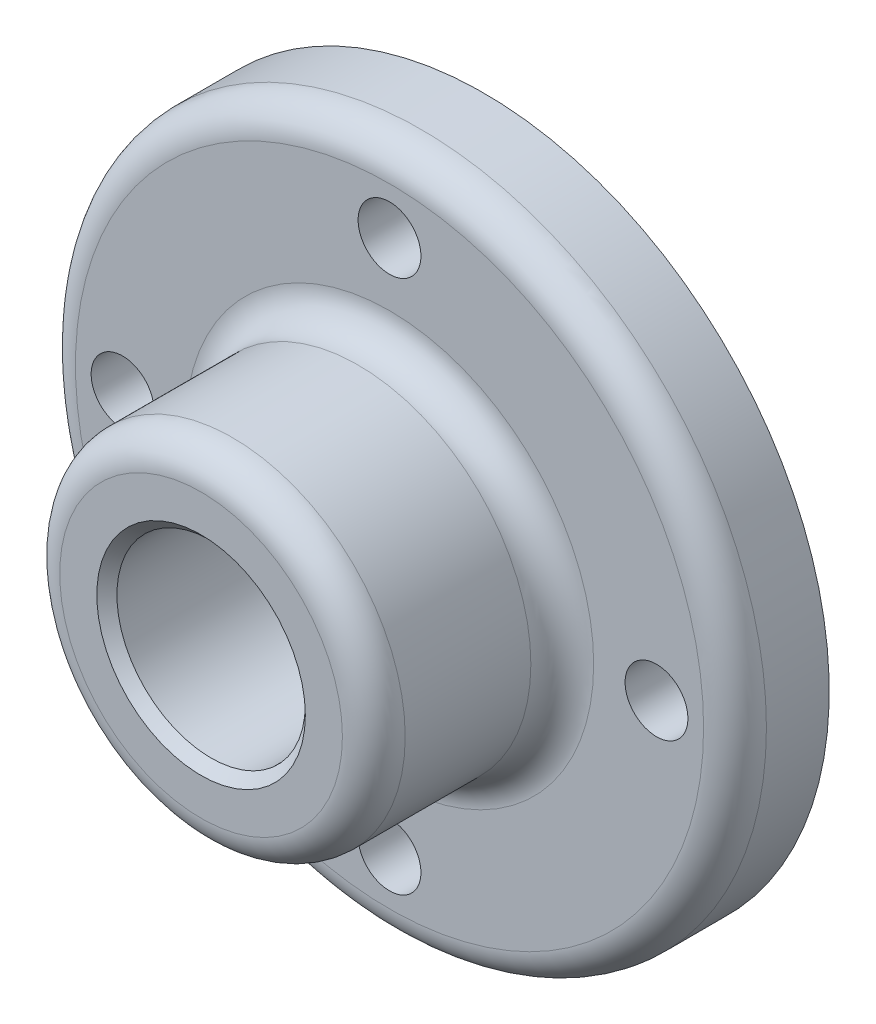
ISO-10303-21;
HEADER;
FILE_DESCRIPTION(('STEP AP214'),'2;1');
FILE_NAME('part.step','',(''),(''),'','','');
FILE_SCHEMA(('AUTOMOTIVE_DESIGN { 1 0 10303 214 1 1 1 1 }'));
ENDSEC;
DATA;
#1=APPLICATION_CONTEXT('core data for automotive mechanical design processes');
#2=APPLICATION_PROTOCOL_DEFINITION('international standard','automotive_design',2000,#1);
#3=PRODUCT_CONTEXT('',#1,'mechanical');
#4=PRODUCT('Part','Part','',(#3));
#5=PRODUCT_RELATED_PRODUCT_CATEGORY('part','',(#4));
#6=PRODUCT_DEFINITION_FORMATION('','',#4);
#7=PRODUCT_DEFINITION_CONTEXT('part definition',#1,'design');
#8=PRODUCT_DEFINITION('design','',#6,#7);
#9=PRODUCT_DEFINITION_SHAPE('','',#8);
#10=(LENGTH_UNIT() NAMED_UNIT(*) SI_UNIT(.MILLI.,.METRE.));
#11=(NAMED_UNIT(*) PLANE_ANGLE_UNIT() SI_UNIT($,.RADIAN.));
#12=(NAMED_UNIT(*) SI_UNIT($,.STERADIAN.) SOLID_ANGLE_UNIT());
#13=UNCERTAINTY_MEASURE_WITH_UNIT(LENGTH_MEASURE(1.E-05),#10,'distance_accuracy_value','');
#14=(GEOMETRIC_REPRESENTATION_CONTEXT(3) GLOBAL_UNCERTAINTY_ASSIGNED_CONTEXT((#13)) GLOBAL_UNIT_ASSIGNED_CONTEXT((#10,
#11,#12)) REPRESENTATION_CONTEXT('',''));
#15=CARTESIAN_POINT('',(0.,0.,0.));
#16=DIRECTION('',(0.,0.,1.));
#17=DIRECTION('',(1.,0.,0.));
#18=AXIS2_PLACEMENT_3D('',#15,#16,#17);
#19=CARTESIAN_POINT('',(0.,0.,19.05));
#20=DIRECTION('',(0.,0.,-1.));
#21=DIRECTION('',(-1.,0.,0.));
#22=AXIS2_PLACEMENT_3D('',#19,#20,#21);
#23=CYLINDRICAL_SURFACE('',#22,69.85);
#24=CARTESIAN_POINT('',(0.,0.,12.7));
#25=DIRECTION('',(0.,0.,1.));
#26=DIRECTION('',(1.,0.,0.));
#27=AXIS2_PLACEMENT_3D('',#24,#25,#26);
#28=CIRCLE('',#27,69.85);
#29=CARTESIAN_POINT('',(-69.85,0.,12.7));
#30=VERTEX_POINT('',#29);
#31=EDGE_CURVE('E51',#30,#30,#28,.F.);
#32=CARTESIAN_POINT('',(0.,0.,0.));
#33=DIRECTION('',(0.,0.,1.));
#34=DIRECTION('',(1.,0.,0.));
#35=AXIS2_PLACEMENT_3D('',#32,#33,#34);
#36=CIRCLE('',#35,69.85);
#37=CARTESIAN_POINT('',(-69.85,0.,0.));
#38=VERTEX_POINT('',#37);
#39=EDGE_CURVE('E72',#38,#38,#36,.T.);
#40=CARTESIAN_POINT('',(-69.85,0.,12.7));
#41=CARTESIAN_POINT('',(-69.85,0.,12.5677083333333));
#42=CARTESIAN_POINT('',(-69.85,0.,12.4354166666667));
#43=CARTESIAN_POINT('',(-69.85,0.,12.1708333333333));
#44=CARTESIAN_POINT('',(-69.85,0.,12.0385416666667));
#45=CARTESIAN_POINT('',(-69.85,0.,11.7739583333333));
#46=CARTESIAN_POINT('',(-69.85,0.,11.6416666666667));
#47=CARTESIAN_POINT('',(-69.85,0.,11.3770833333333));
#48=CARTESIAN_POINT('',(-69.85,0.,11.2447916666667));
#49=CARTESIAN_POINT('',(-69.85,0.,10.9802083333333));
#50=CARTESIAN_POINT('',(-69.85,0.,10.8479166666667));
#51=CARTESIAN_POINT('',(-69.85,0.,10.5833333333333));
#52=CARTESIAN_POINT('',(-69.85,0.,10.4510416666667));
#53=CARTESIAN_POINT('',(-69.85,0.,10.1864583333333));
#54=CARTESIAN_POINT('',(-69.85,0.,10.0541666666667));
#55=CARTESIAN_POINT('',(-69.85,0.,9.78958333333333));
#56=CARTESIAN_POINT('',(-69.85,0.,9.65729166666667));
#57=CARTESIAN_POINT('',(-69.85,0.,9.39270833333333));
#58=CARTESIAN_POINT('',(-69.85,0.,9.26041666666667));
#59=CARTESIAN_POINT('',(-69.85,0.,8.99583333333334));
#60=CARTESIAN_POINT('',(-69.85,0.,8.86354166666667));
#61=CARTESIAN_POINT('',(-69.85,0.,8.59895833333333));
#62=CARTESIAN_POINT('',(-69.85,0.,8.46666666666667));
#63=CARTESIAN_POINT('',(-69.85,0.,8.20208333333333));
#64=CARTESIAN_POINT('',(-69.85,0.,8.06979166666667));
#65=CARTESIAN_POINT('',(-69.85,0.,7.80520833333333));
#66=CARTESIAN_POINT('',(-69.85,0.,7.67291666666667));
#67=CARTESIAN_POINT('',(-69.85,0.,7.40833333333333));
#68=CARTESIAN_POINT('',(-69.85,0.,7.27604166666667));
#69=CARTESIAN_POINT('',(-69.85,0.,7.01145833333333));
#70=CARTESIAN_POINT('',(-69.85,0.,6.87916666666667));
#71=CARTESIAN_POINT('',(-69.85,0.,6.61458333333333));
#72=CARTESIAN_POINT('',(-69.85,0.,6.48229166666667));
#73=CARTESIAN_POINT('',(-69.85,0.,6.21770833333333));
#74=CARTESIAN_POINT('',(-69.85,0.,6.08541666666667));
#75=CARTESIAN_POINT('',(-69.85,0.,5.82083333333333));
#76=CARTESIAN_POINT('',(-69.85,0.,5.68854166666667));
#77=CARTESIAN_POINT('',(-69.85,0.,5.42395833333333));
#78=CARTESIAN_POINT('',(-69.85,0.,5.29166666666667));
#79=CARTESIAN_POINT('',(-69.85,0.,5.02708333333333));
#80=CARTESIAN_POINT('',(-69.85,0.,4.89479166666667));
#81=CARTESIAN_POINT('',(-69.85,0.,4.63020833333333));
#82=CARTESIAN_POINT('',(-69.85,0.,4.49791666666667));
#83=CARTESIAN_POINT('',(-69.85,0.,4.23333333333333));
#84=CARTESIAN_POINT('',(-69.85,0.,4.10104166666667));
#85=CARTESIAN_POINT('',(-69.85,0.,3.83645833333333));
#86=CARTESIAN_POINT('',(-69.85,0.,3.70416666666667));
#87=CARTESIAN_POINT('',(-69.85,0.,3.43958333333333));
#88=CARTESIAN_POINT('',(-69.85,0.,3.30729166666667));
#89=CARTESIAN_POINT('',(-69.85,0.,3.04270833333333));
#90=CARTESIAN_POINT('',(-69.85,0.,2.91041666666667));
#91=CARTESIAN_POINT('',(-69.85,0.,2.64583333333333));
#92=CARTESIAN_POINT('',(-69.85,0.,2.51354166666667));
#93=CARTESIAN_POINT('',(-69.85,0.,2.24895833333333));
#94=CARTESIAN_POINT('',(-69.85,0.,2.11666666666667));
#95=CARTESIAN_POINT('',(-69.85,0.,1.85208333333333));
#96=CARTESIAN_POINT('',(-69.85,0.,1.71979166666667));
#97=CARTESIAN_POINT('',(-69.85,0.,1.45520833333333));
#98=CARTESIAN_POINT('',(-69.85,0.,1.32291666666667));
#99=CARTESIAN_POINT('',(-69.85,0.,1.05833333333333));
#100=CARTESIAN_POINT('',(-69.85,0.,0.926041666666666));
#101=CARTESIAN_POINT('',(-69.85,0.,0.661458333333332));
#102=CARTESIAN_POINT('',(-69.85,0.,0.529166666666665));
#103=CARTESIAN_POINT('',(-69.85,0.,0.264583333333332));
#104=CARTESIAN_POINT('',(-69.85,0.,0.132291666666666));
#105=CARTESIAN_POINT('',(-69.85,0.,0.));
#106=B_SPLINE_CURVE_WITH_KNOTS('',3,(#40,#41,#42,#43,#44,#45,#46,#47,#48,#49,#50,#51,#52,#53,
#54,#55,#56,#57,#58,#59,#60,#61,#62,#63,#64,#65,#66,#67,#68,#69,#70,#71,#72,#73,#74,#75,#76,#77,
#78,#79,#80,#81,#82,#83,#84,#85,#86,#87,#88,#89,#90,#91,#92,#93,#94,#95,#96,#97,#98,#99,#100,
#101,#102,#103,#104,#105),.UNSPECIFIED.,.F.,.F.,(4,2,2,2,2,2,2,2,2,2,2,2,2,2,2,2,2,2,2,2,2,2,2,
2,2,2,2,2,2,2,2,2,4),(0.,0.396874999999998,0.793749999999999,1.190625,1.5875,1.984375,2.38125,
2.778125,3.175,3.571875,3.96875,4.365625,4.7625,5.159375,5.55625,5.953125,6.35,6.746875,7.14375,
7.540625,7.9375,8.334375,8.73125,9.128125,9.525,9.921875,10.31875,10.715625,11.1125,11.509375,
11.90625,12.303125,12.7),.UNSPECIFIED.);
#107=EDGE_CURVE('BSEAM39',#30,#38,#106,.T.);
#108=ORIENTED_EDGE('',*,*,#31,.T.);
#109=ORIENTED_EDGE('',*,*,#39,.T.);
#110=ORIENTED_EDGE('',*,*,#107,.T.);
#111=ORIENTED_EDGE('',*,*,#107,.F.);
#112=EDGE_LOOP('',(#108,#110,#109,#111));
#113=FACE_BOUND('',#112,.T.);
#114=ADVANCED_FACE('F39',(#113),#23,.T.);
#115=CARTESIAN_POINT('',(0.,0.,19.05));
#116=DIRECTION('',(0.,0.,1.));
#117=DIRECTION('',(1.,0.,0.));
#118=AXIS2_PLACEMENT_3D('',#115,#116,#117);
#119=PLANE('',#118);
#120=CARTESIAN_POINT('',(0.,0.,19.05));
#121=DIRECTION('',(0.,0.,1.));
#122=DIRECTION('',(1.,0.,0.));
#123=AXIS2_PLACEMENT_3D('',#120,#121,#122);
#124=CIRCLE('',#123,41.275);
#125=CARTESIAN_POINT('',(41.275,0.,19.05));
#126=VERTEX_POINT('',#125);
#127=EDGE_CURVE('E55',#126,#126,#124,.F.);
#128=ORIENTED_EDGE('',*,*,#127,.T.);
#129=EDGE_LOOP('',(#128));
#130=FACE_BOUND('',#129,.T.);
#131=CARTESIAN_POINT('',(0.,0.,19.05));
#132=DIRECTION('',(0.,0.,1.));
#133=DIRECTION('',(1.,0.,0.));
#134=AXIS2_PLACEMENT_3D('',#131,#132,#133);
#135=CIRCLE('',#134,63.5);
#136=CARTESIAN_POINT('',(63.5,0.,19.05));
#137=VERTEX_POINT('',#136);
#138=EDGE_CURVE('E60',#137,#137,#135,.T.);
#139=ORIENTED_EDGE('',*,*,#138,.T.);
#140=EDGE_LOOP('',(#139));
#141=FACE_BOUND('',#140,.T.);
#142=CARTESIAN_POINT('',(0.,53.975,19.05));
#143=DIRECTION('',(0.,0.,1.));
#144=DIRECTION('',(1.,0.,0.));
#145=AXIS2_PLACEMENT_3D('',#142,#143,#144);
#146=CIRCLE('',#145,6.35);
#147=CARTESIAN_POINT('',(6.35,53.975,19.05));
#148=VERTEX_POINT('',#147);
#149=EDGE_CURVE('E97',#148,#148,#146,.T.);
#150=ORIENTED_EDGE('',*,*,#149,.F.);
#151=EDGE_LOOP('',(#150));
#152=FACE_BOUND('',#151,.T.);
#153=CARTESIAN_POINT('',(53.975,-1.88452705264058E-13,19.05));
#154=DIRECTION('',(0.,0.,1.));
#155=DIRECTION('',(1.,0.,0.));
#156=AXIS2_PLACEMENT_3D('',#153,#154,#155);
#157=CIRCLE('',#156,6.35);
#158=CARTESIAN_POINT('',(60.325,-1.88452705264058E-13,19.05));
#159=VERTEX_POINT('',#158);
#160=EDGE_CURVE('E94',#159,#159,#157,.T.);
#161=ORIENTED_EDGE('',*,*,#160,.F.);
#162=EDGE_LOOP('',(#161));
#163=FACE_BOUND('',#162,.T.);
#164=CARTESIAN_POINT('',(-3.76905410528116E-13,-53.975,19.05));
#165=DIRECTION('',(0.,0.,1.));
#166=DIRECTION('',(1.,0.,0.));
#167=AXIS2_PLACEMENT_3D('',#164,#165,#166);
#168=CIRCLE('',#167,6.35);
#169=CARTESIAN_POINT('',(6.34999999999962,-53.975,19.05));
#170=VERTEX_POINT('',#169);
#171=EDGE_CURVE('E88',#170,#170,#168,.T.);
#172=ORIENTED_EDGE('',*,*,#171,.F.);
#173=EDGE_LOOP('',(#172));
#174=FACE_BOUND('',#173,.T.);
#175=CARTESIAN_POINT('',(-53.975,5.65358115792174E-13,19.05));
#176=DIRECTION('',(0.,0.,1.));
#177=DIRECTION('',(1.,0.,0.));
#178=AXIS2_PLACEMENT_3D('',#175,#176,#177);
#179=CIRCLE('',#178,6.35);
#180=CARTESIAN_POINT('',(-47.625,5.65358115792174E-13,19.05));
#181=VERTEX_POINT('',#180);
#182=EDGE_CURVE('E82',#181,#181,#179,.T.);
#183=ORIENTED_EDGE('',*,*,#182,.F.);
#184=EDGE_LOOP('',(#183));
#185=FACE_BOUND('',#184,.T.);
#186=ADVANCED_FACE('F114',(#130,#141,#152,#163,#174,#185),#119,.T.);
#187=CARTESIAN_POINT('',(0.,0.,0.));
#188=DIRECTION('',(0.,0.,1.));
#189=DIRECTION('',(1.,0.,0.));
#190=AXIS2_PLACEMENT_3D('',#187,#188,#189);
#191=PLANE('',#190);
#192=CARTESIAN_POINT('',(0.,53.975,0.));
#193=DIRECTION('',(0.,0.,1.));
#194=DIRECTION('',(1.,0.,0.));
#195=AXIS2_PLACEMENT_3D('',#192,#193,#194);
#196=CIRCLE('',#195,6.35);
#197=CARTESIAN_POINT('',(6.35,53.975,0.));
#198=VERTEX_POINT('',#197);
#199=EDGE_CURVE('E78',#198,#198,#196,.T.);
#200=ORIENTED_EDGE('',*,*,#199,.T.);
#201=EDGE_LOOP('',(#200));
#202=FACE_BOUND('',#201,.T.);
#203=CARTESIAN_POINT('',(53.975,-1.88452705264058E-13,0.));
#204=DIRECTION('',(0.,0.,1.));
#205=DIRECTION('',(1.,0.,0.));
#206=AXIS2_PLACEMENT_3D('',#203,#204,#205);
#207=CIRCLE('',#206,6.35);
#208=CARTESIAN_POINT('',(60.325,-1.88452705264058E-13,0.));
#209=VERTEX_POINT('',#208);
#210=EDGE_CURVE('E91',#209,#209,#207,.T.);
#211=ORIENTED_EDGE('',*,*,#210,.T.);
#212=EDGE_LOOP('',(#211));
#213=FACE_BOUND('',#212,.T.);
#214=CARTESIAN_POINT('',(-3.76905410528116E-13,-53.975,0.));
#215=DIRECTION('',(0.,0.,1.));
#216=DIRECTION('',(1.,0.,0.));
#217=AXIS2_PLACEMENT_3D('',#214,#215,#216);
#218=CIRCLE('',#217,6.35);
#219=CARTESIAN_POINT('',(6.34999999999962,-53.975,0.));
#220=VERTEX_POINT('',#219);
#221=EDGE_CURVE('E85',#220,#220,#218,.T.);
#222=ORIENTED_EDGE('',*,*,#221,.T.);
#223=EDGE_LOOP('',(#222));
#224=FACE_BOUND('',#223,.T.);
#225=CARTESIAN_POINT('',(-53.975,5.65358115792174E-13,0.));
#226=DIRECTION('',(0.,0.,1.));
#227=DIRECTION('',(1.,0.,0.));
#228=AXIS2_PLACEMENT_3D('',#225,#226,#227);
#229=CIRCLE('',#228,6.35);
#230=CARTESIAN_POINT('',(-47.625,5.65358115792174E-13,0.));
#231=VERTEX_POINT('',#230);
#232=EDGE_CURVE('E79',#231,#231,#229,.T.);
#233=ORIENTED_EDGE('',*,*,#232,.T.);
#234=EDGE_LOOP('',(#233));
#235=FACE_BOUND('',#234,.T.);
#236=CARTESIAN_POINT('',(0.,0.,0.));
#237=DIRECTION('',(0.,0.,1.));
#238=DIRECTION('',(1.,0.,0.));
#239=AXIS2_PLACEMENT_3D('',#236,#237,#238);
#240=CIRCLE('',#239,19.05);
#241=CARTESIAN_POINT('',(19.05,0.,0.));
#242=VERTEX_POINT('',#241);
#243=EDGE_CURVE('E75',#242,#242,#240,.T.);
#244=ORIENTED_EDGE('',*,*,#243,.T.);
#245=EDGE_LOOP('',(#244));
#246=FACE_BOUND('',#245,.T.);
#247=ORIENTED_EDGE('',*,*,#39,.F.);
#248=EDGE_LOOP('',(#247));
#249=FACE_BOUND('',#248,.T.);
#250=ADVANCED_FACE('F103',(#202,#213,#224,#235,#246,#249),#191,.F.);
#251=CARTESIAN_POINT('',(0.,0.,-79.7328173317607));
#252=DIRECTION('',(0.,0.,1.));
#253=DIRECTION('',(1.,0.,0.));
#254=AXIS2_PLACEMENT_3D('',#251,#252,#253);
#255=CYLINDRICAL_SURFACE('',#254,34.925);
#256=CARTESIAN_POINT('',(0.,0.,50.8));
#257=DIRECTION('',(0.,0.,1.));
#258=DIRECTION('',(1.,0.,0.));
#259=AXIS2_PLACEMENT_3D('',#256,#257,#258);
#260=CIRCLE('',#259,34.925);
#261=CARTESIAN_POINT('',(34.925,0.,50.8));
#262=VERTEX_POINT('',#261);
#263=EDGE_CURVE('E63',#262,#262,#260,.F.);
#264=ORIENTED_EDGE('',*,*,#263,.T.);
#265=EDGE_LOOP('',(#264));
#266=FACE_BOUND('',#265,.T.);
#267=CARTESIAN_POINT('',(0.,0.,25.4));
#268=DIRECTION('',(0.,0.,1.));
#269=DIRECTION('',(1.,0.,0.));
#270=AXIS2_PLACEMENT_3D('',#267,#268,#269);
#271=CIRCLE('',#270,34.925);
#272=CARTESIAN_POINT('',(34.925,0.,25.4));
#273=VERTEX_POINT('',#272);
#274=EDGE_CURVE('E66',#273,#273,#271,.T.);
#275=ORIENTED_EDGE('',*,*,#274,.T.);
#276=EDGE_LOOP('',(#275));
#277=FACE_BOUND('',#276,.T.);
#278=ADVANCED_FACE('F180',(#266,#277),#255,.T.);
#279=CARTESIAN_POINT('',(0.,0.,57.15));
#280=DIRECTION('',(0.,0.,1.));
#281=DIRECTION('',(1.,0.,0.));
#282=AXIS2_PLACEMENT_3D('',#279,#280,#281);
#283=PLANE('',#282);
#284=CARTESIAN_POINT('',(0.,0.,57.15));
#285=DIRECTION('',(0.,0.,1.));
#286=DIRECTION('',(1.,0.,0.));
#287=AXIS2_PLACEMENT_3D('',#284,#285,#286);
#288=CIRCLE('',#287,21.082);
#289=CARTESIAN_POINT('',(21.082,0.,57.15));
#290=VERTEX_POINT('',#289);
#291=EDGE_CURVE('E10',#290,#290,#288,.F.);
#292=ORIENTED_EDGE('',*,*,#291,.T.);
#293=EDGE_LOOP('',(#292));
#294=FACE_BOUND('',#293,.T.);
#295=CARTESIAN_POINT('',(0.,0.,57.15));
#296=DIRECTION('',(0.,0.,1.));
#297=DIRECTION('',(1.,0.,0.));
#298=AXIS2_PLACEMENT_3D('',#295,#296,#297);
#299=CIRCLE('',#298,28.575);
#300=CARTESIAN_POINT('',(28.575,0.,57.15));
#301=VERTEX_POINT('',#300);
#302=EDGE_CURVE('E69',#301,#301,#299,.T.);
#303=ORIENTED_EDGE('',*,*,#302,.T.);
#304=EDGE_LOOP('',(#303));
#305=FACE_BOUND('',#304,.T.);
#306=ADVANCED_FACE('F138',(#294,#305),#283,.T.);
#307=CARTESIAN_POINT('',(0.,0.,0.));
#308=DIRECTION('',(0.,0.,1.));
#309=DIRECTION('',(1.,0.,0.));
#310=AXIS2_PLACEMENT_3D('',#307,#308,#309);
#311=CYLINDRICAL_SURFACE('',#310,19.05);
#312=CARTESIAN_POINT('',(0.,0.,55.118));
#313=DIRECTION('',(0.,0.,1.));
#314=DIRECTION('',(1.,0.,0.));
#315=AXIS2_PLACEMENT_3D('',#312,#313,#314);
#316=CIRCLE('',#315,19.05);
#317=CARTESIAN_POINT('',(19.05,0.,55.118));
#318=VERTEX_POINT('',#317);
#319=EDGE_CURVE('E47',#318,#318,#316,.T.);
#320=ORIENTED_EDGE('',*,*,#319,.T.);
#321=EDGE_LOOP('',(#320));
#322=FACE_BOUND('',#321,.T.);
#323=ORIENTED_EDGE('',*,*,#243,.F.);
#324=EDGE_LOOP('',(#323));
#325=FACE_BOUND('',#324,.T.);
#326=ADVANCED_FACE('F128',(#322,#325),#311,.F.);
#327=CARTESIAN_POINT('',(-53.975,5.65358115792174E-13,0.));
#328=DIRECTION('',(0.,0.,1.));
#329=DIRECTION('',(1.,0.,0.));
#330=AXIS2_PLACEMENT_3D('',#327,#328,#329);
#331=CYLINDRICAL_SURFACE('',#330,6.35);
#332=CARTESIAN_POINT('',(-47.625,5.65358115792174E-13,0.));
#333=CARTESIAN_POINT('',(-47.625,5.65358115792174E-13,0.1984375));
#334=CARTESIAN_POINT('',(-47.625,5.65358115792174E-13,0.396875));
#335=CARTESIAN_POINT('',(-47.625,5.65358115792174E-13,0.79375));
#336=CARTESIAN_POINT('',(-47.625,5.65358115792174E-13,0.9921875));
#337=CARTESIAN_POINT('',(-47.625,5.65358115792174E-13,1.3890625));
#338=CARTESIAN_POINT('',(-47.625,5.65358115792174E-13,1.5875));
#339=CARTESIAN_POINT('',(-47.625,5.65358115792174E-13,1.984375));
#340=CARTESIAN_POINT('',(-47.625,5.65358115792174E-13,2.1828125));
#341=CARTESIAN_POINT('',(-47.625,5.65358115792174E-13,2.5796875));
#342=CARTESIAN_POINT('',(-47.625,5.65358115792174E-13,2.778125));
#343=CARTESIAN_POINT('',(-47.625,5.65358115792174E-13,3.175));
#344=CARTESIAN_POINT('',(-47.625,5.65358115792174E-13,3.3734375));
#345=CARTESIAN_POINT('',(-47.625,5.65358115792174E-13,3.7703125));
#346=CARTESIAN_POINT('',(-47.625,5.65358115792174E-13,3.96875));
#347=CARTESIAN_POINT('',(-47.625,5.65358115792174E-13,4.365625));
#348=CARTESIAN_POINT('',(-47.625,5.65358115792174E-13,4.5640625));
#349=CARTESIAN_POINT('',(-47.625,5.65358115792174E-13,4.9609375));
#350=CARTESIAN_POINT('',(-47.625,5.65358115792174E-13,5.159375));
#351=CARTESIAN_POINT('',(-47.625,5.65358115792174E-13,5.55625));
#352=CARTESIAN_POINT('',(-47.625,5.65358115792174E-13,5.7546875));
#353=CARTESIAN_POINT('',(-47.625,5.65358115792174E-13,6.1515625));
#354=CARTESIAN_POINT('',(-47.625,5.65358115792174E-13,6.35));
#355=CARTESIAN_POINT('',(-47.625,5.65358115792174E-13,6.746875));
#356=CARTESIAN_POINT('',(-47.625,5.65358115792174E-13,6.9453125));
#357=CARTESIAN_POINT('',(-47.625,5.65358115792174E-13,7.3421875));
#358=CARTESIAN_POINT('',(-47.625,5.65358115792174E-13,7.540625));
#359=CARTESIAN_POINT('',(-47.625,5.65358115792174E-13,7.9375));
#360=CARTESIAN_POINT('',(-47.625,5.65358115792174E-13,8.1359375));
#361=CARTESIAN_POINT('',(-47.625,5.65358115792174E-13,8.5328125));
#362=CARTESIAN_POINT('',(-47.625,5.65358115792174E-13,8.73125));
#363=CARTESIAN_POINT('',(-47.625,5.65358115792174E-13,9.128125));
#364=CARTESIAN_POINT('',(-47.625,5.65358115792174E-13,9.3265625));
#365=CARTESIAN_POINT('',(-47.625,5.65358115792174E-13,9.7234375));
#366=CARTESIAN_POINT('',(-47.625,5.65358115792174E-13,9.921875));
#367=CARTESIAN_POINT('',(-47.625,5.65358115792174E-13,10.31875));
#368=CARTESIAN_POINT('',(-47.625,5.65358115792174E-13,10.5171875));
#369=CARTESIAN_POINT('',(-47.625,5.65358115792174E-13,10.9140625));
#370=CARTESIAN_POINT('',(-47.625,5.65358115792174E-13,11.1125));
#371=CARTESIAN_POINT('',(-47.625,5.65358115792174E-13,11.509375));
#372=CARTESIAN_POINT('',(-47.625,5.65358115792174E-13,11.7078125));
#373=CARTESIAN_POINT('',(-47.625,5.65358115792174E-13,12.1046875));
#374=CARTESIAN_POINT('',(-47.625,5.65358115792174E-13,12.303125));
#375=CARTESIAN_POINT('',(-47.625,5.65358115792174E-13,12.7));
#376=CARTESIAN_POINT('',(-47.625,5.65358115792174E-13,12.8984375));
#377=CARTESIAN_POINT('',(-47.625,5.65358115792174E-13,13.2953125));
#378=CARTESIAN_POINT('',(-47.625,5.65358115792174E-13,13.49375));
#379=CARTESIAN_POINT('',(-47.625,5.65358115792174E-13,13.890625));
#380=CARTESIAN_POINT('',(-47.625,5.65358115792174E-13,14.0890625));
#381=CARTESIAN_POINT('',(-47.625,5.65358115792174E-13,14.4859375));
#382=CARTESIAN_POINT('',(-47.625,5.65358115792174E-13,14.684375));
#383=CARTESIAN_POINT('',(-47.625,5.65358115792174E-13,15.08125));
#384=CARTESIAN_POINT('',(-47.625,5.65358115792174E-13,15.2796875));
#385=CARTESIAN_POINT('',(-47.625,5.65358115792174E-13,15.6765625));
#386=CARTESIAN_POINT('',(-47.625,5.65358115792174E-13,15.875));
#387=CARTESIAN_POINT('',(-47.625,5.65358115792174E-13,16.271875));
#388=CARTESIAN_POINT('',(-47.625,5.65358115792174E-13,16.4703125));
#389=CARTESIAN_POINT('',(-47.625,5.65358115792174E-13,16.8671875));
#390=CARTESIAN_POINT('',(-47.625,5.65358115792174E-13,17.065625));
#391=CARTESIAN_POINT('',(-47.625,5.65358115792174E-13,17.4625));
#392=CARTESIAN_POINT('',(-47.625,5.65358115792174E-13,17.6609375));
#393=CARTESIAN_POINT('',(-47.625,5.65358115792174E-13,18.0578125));
#394=CARTESIAN_POINT('',(-47.625,5.65358115792174E-13,18.25625));
#395=CARTESIAN_POINT('',(-47.625,5.65358115792174E-13,18.653125));
#396=CARTESIAN_POINT('',(-47.625,5.65358115792174E-13,18.8515625));
#397=CARTESIAN_POINT('',(-47.625,5.65358115792174E-13,19.05));
#398=B_SPLINE_CURVE_WITH_KNOTS('',3,(#332,#333,#334,#335,#336,#337,#338,#339,#340,#341,#342,
#343,#344,#345,#346,#347,#348,#349,#350,#351,#352,#353,#354,#355,#356,#357,#358,#359,#360,#361,
#362,#363,#364,#365,#366,#367,#368,#369,#370,#371,#372,#373,#374,#375,#376,#377,#378,#379,#380,
#381,#382,#383,#384,#385,#386,#387,#388,#389,#390,#391,#392,#393,#394,#395,#396,#397),
.UNSPECIFIED.,.F.,.F.,(4,2,2,2,2,2,2,2,2,2,2,2,2,2,2,2,2,2,2,2,2,2,2,2,2,2,2,2,2,2,2,2,4),(0.,
0.5953125,1.190625,1.7859375,2.38125,2.9765625,3.571875,4.1671875,4.7625,5.3578125,5.953125,
6.5484375,7.14375,7.7390625,8.334375,8.9296875,9.525,10.1203125,10.715625,11.3109375,11.90625,
12.5015625,13.096875,13.6921875,14.2875,14.8828125,15.478125,16.0734375,16.66875,17.2640625,
17.859375,18.4546875,19.05),.UNSPECIFIED.);
#399=EDGE_CURVE('BSEAM125',#231,#181,#398,.T.);
#400=ORIENTED_EDGE('',*,*,#232,.F.);
#401=ORIENTED_EDGE('',*,*,#182,.T.);
#402=ORIENTED_EDGE('',*,*,#399,.T.);
#403=ORIENTED_EDGE('',*,*,#399,.F.);
#404=EDGE_LOOP('',(#400,#402,#401,#403));
#405=FACE_BOUND('',#404,.T.);
#406=ADVANCED_FACE('F125',(#405),#331,.F.);
#407=CARTESIAN_POINT('',(-3.76905410528116E-13,-53.975,0.));
#408=DIRECTION('',(0.,0.,1.));
#409=DIRECTION('',(1.,0.,0.));
#410=AXIS2_PLACEMENT_3D('',#407,#408,#409);
#411=CYLINDRICAL_SURFACE('',#410,6.35);
#412=CARTESIAN_POINT('',(6.34999999999962,-53.975,0.));
#413=CARTESIAN_POINT('',(6.34999999999962,-53.975,0.1984375));
#414=CARTESIAN_POINT('',(6.34999999999962,-53.975,0.396875));
#415=CARTESIAN_POINT('',(6.34999999999962,-53.975,0.79375));
#416=CARTESIAN_POINT('',(6.34999999999962,-53.975,0.9921875));
#417=CARTESIAN_POINT('',(6.34999999999962,-53.975,1.3890625));
#418=CARTESIAN_POINT('',(6.34999999999962,-53.975,1.5875));
#419=CARTESIAN_POINT('',(6.34999999999962,-53.975,1.984375));
#420=CARTESIAN_POINT('',(6.34999999999962,-53.975,2.1828125));
#421=CARTESIAN_POINT('',(6.34999999999962,-53.975,2.5796875));
#422=CARTESIAN_POINT('',(6.34999999999962,-53.975,2.778125));
#423=CARTESIAN_POINT('',(6.34999999999962,-53.975,3.175));
#424=CARTESIAN_POINT('',(6.34999999999962,-53.975,3.3734375));
#425=CARTESIAN_POINT('',(6.34999999999962,-53.975,3.7703125));
#426=CARTESIAN_POINT('',(6.34999999999962,-53.975,3.96875));
#427=CARTESIAN_POINT('',(6.34999999999962,-53.975,4.365625));
#428=CARTESIAN_POINT('',(6.34999999999962,-53.975,4.5640625));
#429=CARTESIAN_POINT('',(6.34999999999962,-53.975,4.9609375));
#430=CARTESIAN_POINT('',(6.34999999999962,-53.975,5.159375));
#431=CARTESIAN_POINT('',(6.34999999999962,-53.975,5.55625));
#432=CARTESIAN_POINT('',(6.34999999999962,-53.975,5.7546875));
#433=CARTESIAN_POINT('',(6.34999999999962,-53.975,6.1515625));
#434=CARTESIAN_POINT('',(6.34999999999962,-53.975,6.35));
#435=CARTESIAN_POINT('',(6.34999999999962,-53.975,6.746875));
#436=CARTESIAN_POINT('',(6.34999999999962,-53.975,6.9453125));
#437=CARTESIAN_POINT('',(6.34999999999962,-53.975,7.3421875));
#438=CARTESIAN_POINT('',(6.34999999999962,-53.975,7.540625));
#439=CARTESIAN_POINT('',(6.34999999999962,-53.975,7.9375));
#440=CARTESIAN_POINT('',(6.34999999999962,-53.975,8.1359375));
#441=CARTESIAN_POINT('',(6.34999999999962,-53.975,8.5328125));
#442=CARTESIAN_POINT('',(6.34999999999962,-53.975,8.73125));
#443=CARTESIAN_POINT('',(6.34999999999962,-53.975,9.128125));
#444=CARTESIAN_POINT('',(6.34999999999962,-53.975,9.3265625));
#445=CARTESIAN_POINT('',(6.34999999999962,-53.975,9.7234375));
#446=CARTESIAN_POINT('',(6.34999999999962,-53.975,9.921875));
#447=CARTESIAN_POINT('',(6.34999999999962,-53.975,10.31875));
#448=CARTESIAN_POINT('',(6.34999999999962,-53.975,10.5171875));
#449=CARTESIAN_POINT('',(6.34999999999962,-53.975,10.9140625));
#450=CARTESIAN_POINT('',(6.34999999999962,-53.975,11.1125));
#451=CARTESIAN_POINT('',(6.34999999999962,-53.975,11.509375));
#452=CARTESIAN_POINT('',(6.34999999999962,-53.975,11.7078125));
#453=CARTESIAN_POINT('',(6.34999999999962,-53.975,12.1046875));
#454=CARTESIAN_POINT('',(6.34999999999962,-53.975,12.303125));
#455=CARTESIAN_POINT('',(6.34999999999962,-53.975,12.7));
#456=CARTESIAN_POINT('',(6.34999999999962,-53.975,12.8984375));
#457=CARTESIAN_POINT('',(6.34999999999962,-53.975,13.2953125));
#458=CARTESIAN_POINT('',(6.34999999999962,-53.975,13.49375));
#459=CARTESIAN_POINT('',(6.34999999999962,-53.975,13.890625));
#460=CARTESIAN_POINT('',(6.34999999999962,-53.975,14.0890625));
#461=CARTESIAN_POINT('',(6.34999999999962,-53.975,14.4859375));
#462=CARTESIAN_POINT('',(6.34999999999962,-53.975,14.684375));
#463=CARTESIAN_POINT('',(6.34999999999962,-53.975,15.08125));
#464=CARTESIAN_POINT('',(6.34999999999962,-53.975,15.2796875));
#465=CARTESIAN_POINT('',(6.34999999999962,-53.975,15.6765625));
#466=CARTESIAN_POINT('',(6.34999999999962,-53.975,15.875));
#467=CARTESIAN_POINT('',(6.34999999999962,-53.975,16.271875));
#468=CARTESIAN_POINT('',(6.34999999999962,-53.975,16.4703125));
#469=CARTESIAN_POINT('',(6.34999999999962,-53.975,16.8671875));
#470=CARTESIAN_POINT('',(6.34999999999962,-53.975,17.065625));
#471=CARTESIAN_POINT('',(6.34999999999962,-53.975,17.4625));
#472=CARTESIAN_POINT('',(6.34999999999962,-53.975,17.6609375));
#473=CARTESIAN_POINT('',(6.34999999999962,-53.975,18.0578125));
#474=CARTESIAN_POINT('',(6.34999999999962,-53.975,18.25625));
#475=CARTESIAN_POINT('',(6.34999999999962,-53.975,18.653125));
#476=CARTESIAN_POINT('',(6.34999999999962,-53.975,18.8515625));
#477=CARTESIAN_POINT('',(6.34999999999962,-53.975,19.05));
#478=B_SPLINE_CURVE_WITH_KNOTS('',3,(#412,#413,#414,#415,#416,#417,#418,#419,#420,#421,#422,
#423,#424,#425,#426,#427,#428,#429,#430,#431,#432,#433,#434,#435,#436,#437,#438,#439,#440,#441,
#442,#443,#444,#445,#446,#447,#448,#449,#450,#451,#452,#453,#454,#455,#456,#457,#458,#459,#460,
#461,#462,#463,#464,#465,#466,#467,#468,#469,#470,#471,#472,#473,#474,#475,#476,#477),
.UNSPECIFIED.,.F.,.F.,(4,2,2,2,2,2,2,2,2,2,2,2,2,2,2,2,2,2,2,2,2,2,2,2,2,2,2,2,2,2,2,2,4),(0.,
0.5953125,1.190625,1.7859375,2.38125,2.9765625,3.571875,4.1671875,4.7625,5.3578125,5.953125,
6.5484375,7.14375,7.7390625,8.334375,8.9296875,9.525,10.1203125,10.715625,11.3109375,11.90625,
12.5015625,13.096875,13.6921875,14.2875,14.8828125,15.478125,16.0734375,16.66875,17.2640625,
17.859375,18.4546875,19.05),.UNSPECIFIED.);
#479=EDGE_CURVE('BSEAM127',#220,#170,#478,.T.);
#480=ORIENTED_EDGE('',*,*,#221,.F.);
#481=ORIENTED_EDGE('',*,*,#171,.T.);
#482=ORIENTED_EDGE('',*,*,#479,.T.);
#483=ORIENTED_EDGE('',*,*,#479,.F.);
#484=EDGE_LOOP('',(#480,#482,#481,#483));
#485=FACE_BOUND('',#484,.T.);
#486=ADVANCED_FACE('F127',(#485),#411,.F.);
#487=CARTESIAN_POINT('',(53.975,-1.88452705264058E-13,0.));
#488=DIRECTION('',(0.,0.,1.));
#489=DIRECTION('',(1.,0.,0.));
#490=AXIS2_PLACEMENT_3D('',#487,#488,#489);
#491=CYLINDRICAL_SURFACE('',#490,6.35);
#492=CARTESIAN_POINT('',(60.325,-1.88452705264058E-13,0.));
#493=CARTESIAN_POINT('',(60.325,-1.88452705264058E-13,0.1984375));
#494=CARTESIAN_POINT('',(60.325,-1.88452705264058E-13,0.396875));
#495=CARTESIAN_POINT('',(60.325,-1.88452705264058E-13,0.79375));
#496=CARTESIAN_POINT('',(60.325,-1.88452705264058E-13,0.9921875));
#497=CARTESIAN_POINT('',(60.325,-1.88452705264058E-13,1.3890625));
#498=CARTESIAN_POINT('',(60.325,-1.88452705264058E-13,1.5875));
#499=CARTESIAN_POINT('',(60.325,-1.88452705264058E-13,1.984375));
#500=CARTESIAN_POINT('',(60.325,-1.88452705264058E-13,2.1828125));
#501=CARTESIAN_POINT('',(60.325,-1.88452705264058E-13,2.5796875));
#502=CARTESIAN_POINT('',(60.325,-1.88452705264058E-13,2.778125));
#503=CARTESIAN_POINT('',(60.325,-1.88452705264058E-13,3.175));
#504=CARTESIAN_POINT('',(60.325,-1.88452705264058E-13,3.3734375));
#505=CARTESIAN_POINT('',(60.325,-1.88452705264058E-13,3.7703125));
#506=CARTESIAN_POINT('',(60.325,-1.88452705264058E-13,3.96875));
#507=CARTESIAN_POINT('',(60.325,-1.88452705264058E-13,4.365625));
#508=CARTESIAN_POINT('',(60.325,-1.88452705264058E-13,4.5640625));
#509=CARTESIAN_POINT('',(60.325,-1.88452705264058E-13,4.9609375));
#510=CARTESIAN_POINT('',(60.325,-1.88452705264058E-13,5.159375));
#511=CARTESIAN_POINT('',(60.325,-1.88452705264058E-13,5.55625));
#512=CARTESIAN_POINT('',(60.325,-1.88452705264058E-13,5.7546875));
#513=CARTESIAN_POINT('',(60.325,-1.88452705264058E-13,6.1515625));
#514=CARTESIAN_POINT('',(60.325,-1.88452705264058E-13,6.35));
#515=CARTESIAN_POINT('',(60.325,-1.88452705264058E-13,6.746875));
#516=CARTESIAN_POINT('',(60.325,-1.88452705264058E-13,6.9453125));
#517=CARTESIAN_POINT('',(60.325,-1.88452705264058E-13,7.3421875));
#518=CARTESIAN_POINT('',(60.325,-1.88452705264058E-13,7.540625));
#519=CARTESIAN_POINT('',(60.325,-1.88452705264058E-13,7.9375));
#520=CARTESIAN_POINT('',(60.325,-1.88452705264058E-13,8.1359375));
#521=CARTESIAN_POINT('',(60.325,-1.88452705264058E-13,8.5328125));
#522=CARTESIAN_POINT('',(60.325,-1.88452705264058E-13,8.73125));
#523=CARTESIAN_POINT('',(60.325,-1.88452705264058E-13,9.128125));
#524=CARTESIAN_POINT('',(60.325,-1.88452705264058E-13,9.3265625));
#525=CARTESIAN_POINT('',(60.325,-1.88452705264058E-13,9.7234375));
#526=CARTESIAN_POINT('',(60.325,-1.88452705264058E-13,9.921875));
#527=CARTESIAN_POINT('',(60.325,-1.88452705264058E-13,10.31875));
#528=CARTESIAN_POINT('',(60.325,-1.88452705264058E-13,10.5171875));
#529=CARTESIAN_POINT('',(60.325,-1.88452705264058E-13,10.9140625));
#530=CARTESIAN_POINT('',(60.325,-1.88452705264058E-13,11.1125));
#531=CARTESIAN_POINT('',(60.325,-1.88452705264058E-13,11.509375));
#532=CARTESIAN_POINT('',(60.325,-1.88452705264058E-13,11.7078125));
#533=CARTESIAN_POINT('',(60.325,-1.88452705264058E-13,12.1046875));
#534=CARTESIAN_POINT('',(60.325,-1.88452705264058E-13,12.303125));
#535=CARTESIAN_POINT('',(60.325,-1.88452705264058E-13,12.7));
#536=CARTESIAN_POINT('',(60.325,-1.88452705264058E-13,12.8984375));
#537=CARTESIAN_POINT('',(60.325,-1.88452705264058E-13,13.2953125));
#538=CARTESIAN_POINT('',(60.325,-1.88452705264058E-13,13.49375));
#539=CARTESIAN_POINT('',(60.325,-1.88452705264058E-13,13.890625));
#540=CARTESIAN_POINT('',(60.325,-1.88452705264058E-13,14.0890625));
#541=CARTESIAN_POINT('',(60.325,-1.88452705264058E-13,14.4859375));
#542=CARTESIAN_POINT('',(60.325,-1.88452705264058E-13,14.684375));
#543=CARTESIAN_POINT('',(60.325,-1.88452705264058E-13,15.08125));
#544=CARTESIAN_POINT('',(60.325,-1.88452705264058E-13,15.2796875));
#545=CARTESIAN_POINT('',(60.325,-1.88452705264058E-13,15.6765625));
#546=CARTESIAN_POINT('',(60.325,-1.88452705264058E-13,15.875));
#547=CARTESIAN_POINT('',(60.325,-1.88452705264058E-13,16.271875));
#548=CARTESIAN_POINT('',(60.325,-1.88452705264058E-13,16.4703125));
#549=CARTESIAN_POINT('',(60.325,-1.88452705264058E-13,16.8671875));
#550=CARTESIAN_POINT('',(60.325,-1.88452705264058E-13,17.065625));
#551=CARTESIAN_POINT('',(60.325,-1.88452705264058E-13,17.4625));
#552=CARTESIAN_POINT('',(60.325,-1.88452705264058E-13,17.6609375));
#553=CARTESIAN_POINT('',(60.325,-1.88452705264058E-13,18.0578125));
#554=CARTESIAN_POINT('',(60.325,-1.88452705264058E-13,18.25625));
#555=CARTESIAN_POINT('',(60.325,-1.88452705264058E-13,18.653125));
#556=CARTESIAN_POINT('',(60.325,-1.88452705264058E-13,18.8515625));
#557=CARTESIAN_POINT('',(60.325,-1.88452705264058E-13,19.05));
#558=B_SPLINE_CURVE_WITH_KNOTS('',3,(#492,#493,#494,#495,#496,#497,#498,#499,#500,#501,#502,
#503,#504,#505,#506,#507,#508,#509,#510,#511,#512,#513,#514,#515,#516,#517,#518,#519,#520,#521,
#522,#523,#524,#525,#526,#527,#528,#529,#530,#531,#532,#533,#534,#535,#536,#537,#538,#539,#540,
#541,#542,#543,#544,#545,#546,#547,#548,#549,#550,#551,#552,#553,#554,#555,#556,#557),
.UNSPECIFIED.,.F.,.F.,(4,2,2,2,2,2,2,2,2,2,2,2,2,2,2,2,2,2,2,2,2,2,2,2,2,2,2,2,2,2,2,2,4),(0.,
0.5953125,1.190625,1.7859375,2.38125,2.9765625,3.571875,4.1671875,4.7625,5.3578125,5.953125,
6.5484375,7.14375,7.7390625,8.334375,8.9296875,9.525,10.1203125,10.715625,11.3109375,11.90625,
12.5015625,13.096875,13.6921875,14.2875,14.8828125,15.478125,16.0734375,16.66875,17.2640625,
17.859375,18.4546875,19.05),.UNSPECIFIED.);
#559=EDGE_CURVE('BSEAM110',#209,#159,#558,.T.);
#560=ORIENTED_EDGE('',*,*,#210,.F.);
#561=ORIENTED_EDGE('',*,*,#160,.T.);
#562=ORIENTED_EDGE('',*,*,#559,.T.);
#563=ORIENTED_EDGE('',*,*,#559,.F.);
#564=EDGE_LOOP('',(#560,#562,#561,#563));
#565=FACE_BOUND('',#564,.T.);
#566=ADVANCED_FACE('F110',(#565),#491,.F.);
#567=CARTESIAN_POINT('',(0.,53.975,0.));
#568=DIRECTION('',(0.,0.,1.));
#569=DIRECTION('',(1.,0.,0.));
#570=AXIS2_PLACEMENT_3D('',#567,#568,#569);
#571=CYLINDRICAL_SURFACE('',#570,6.35);
#572=CARTESIAN_POINT('',(6.35,53.975,0.));
#573=CARTESIAN_POINT('',(6.35,53.975,0.1984375));
#574=CARTESIAN_POINT('',(6.35,53.975,0.396875));
#575=CARTESIAN_POINT('',(6.35,53.975,0.79375));
#576=CARTESIAN_POINT('',(6.35,53.975,0.9921875));
#577=CARTESIAN_POINT('',(6.35,53.975,1.3890625));
#578=CARTESIAN_POINT('',(6.35,53.975,1.5875));
#579=CARTESIAN_POINT('',(6.35,53.975,1.984375));
#580=CARTESIAN_POINT('',(6.35,53.975,2.1828125));
#581=CARTESIAN_POINT('',(6.35,53.975,2.5796875));
#582=CARTESIAN_POINT('',(6.35,53.975,2.778125));
#583=CARTESIAN_POINT('',(6.35,53.975,3.175));
#584=CARTESIAN_POINT('',(6.35,53.975,3.3734375));
#585=CARTESIAN_POINT('',(6.35,53.975,3.7703125));
#586=CARTESIAN_POINT('',(6.35,53.975,3.96875));
#587=CARTESIAN_POINT('',(6.35,53.975,4.365625));
#588=CARTESIAN_POINT('',(6.35,53.975,4.5640625));
#589=CARTESIAN_POINT('',(6.35,53.975,4.9609375));
#590=CARTESIAN_POINT('',(6.35,53.975,5.159375));
#591=CARTESIAN_POINT('',(6.35,53.975,5.55625));
#592=CARTESIAN_POINT('',(6.35,53.975,5.7546875));
#593=CARTESIAN_POINT('',(6.35,53.975,6.1515625));
#594=CARTESIAN_POINT('',(6.35,53.975,6.35));
#595=CARTESIAN_POINT('',(6.35,53.975,6.746875));
#596=CARTESIAN_POINT('',(6.35,53.975,6.9453125));
#597=CARTESIAN_POINT('',(6.35,53.975,7.3421875));
#598=CARTESIAN_POINT('',(6.35,53.975,7.540625));
#599=CARTESIAN_POINT('',(6.35,53.975,7.9375));
#600=CARTESIAN_POINT('',(6.35,53.975,8.1359375));
#601=CARTESIAN_POINT('',(6.35,53.975,8.5328125));
#602=CARTESIAN_POINT('',(6.35,53.975,8.73125));
#603=CARTESIAN_POINT('',(6.35,53.975,9.128125));
#604=CARTESIAN_POINT('',(6.35,53.975,9.3265625));
#605=CARTESIAN_POINT('',(6.35,53.975,9.7234375));
#606=CARTESIAN_POINT('',(6.35,53.975,9.921875));
#607=CARTESIAN_POINT('',(6.35,53.975,10.31875));
#608=CARTESIAN_POINT('',(6.35,53.975,10.5171875));
#609=CARTESIAN_POINT('',(6.35,53.975,10.9140625));
#610=CARTESIAN_POINT('',(6.35,53.975,11.1125));
#611=CARTESIAN_POINT('',(6.35,53.975,11.509375));
#612=CARTESIAN_POINT('',(6.35,53.975,11.7078125));
#613=CARTESIAN_POINT('',(6.35,53.975,12.1046875));
#614=CARTESIAN_POINT('',(6.35,53.975,12.303125));
#615=CARTESIAN_POINT('',(6.35,53.975,12.7));
#616=CARTESIAN_POINT('',(6.35,53.975,12.8984375));
#617=CARTESIAN_POINT('',(6.35,53.975,13.2953125));
#618=CARTESIAN_POINT('',(6.35,53.975,13.49375));
#619=CARTESIAN_POINT('',(6.35,53.975,13.890625));
#620=CARTESIAN_POINT('',(6.35,53.975,14.0890625));
#621=CARTESIAN_POINT('',(6.35,53.975,14.4859375));
#622=CARTESIAN_POINT('',(6.35,53.975,14.684375));
#623=CARTESIAN_POINT('',(6.35,53.975,15.08125));
#624=CARTESIAN_POINT('',(6.35,53.975,15.2796875));
#625=CARTESIAN_POINT('',(6.35,53.975,15.6765625));
#626=CARTESIAN_POINT('',(6.35,53.975,15.875));
#627=CARTESIAN_POINT('',(6.35,53.975,16.271875));
#628=CARTESIAN_POINT('',(6.35,53.975,16.4703125));
#629=CARTESIAN_POINT('',(6.35,53.975,16.8671875));
#630=CARTESIAN_POINT('',(6.35,53.975,17.065625));
#631=CARTESIAN_POINT('',(6.35,53.975,17.4625));
#632=CARTESIAN_POINT('',(6.35,53.975,17.6609375));
#633=CARTESIAN_POINT('',(6.35,53.975,18.0578125));
#634=CARTESIAN_POINT('',(6.35,53.975,18.25625));
#635=CARTESIAN_POINT('',(6.35,53.975,18.653125));
#636=CARTESIAN_POINT('',(6.35,53.975,18.8515625));
#637=CARTESIAN_POINT('',(6.35,53.975,19.05));
#638=B_SPLINE_CURVE_WITH_KNOTS('',3,(#572,#573,#574,#575,#576,#577,#578,#579,#580,#581,#582,
#583,#584,#585,#586,#587,#588,#589,#590,#591,#592,#593,#594,#595,#596,#597,#598,#599,#600,#601,
#602,#603,#604,#605,#606,#607,#608,#609,#610,#611,#612,#613,#614,#615,#616,#617,#618,#619,#620,
#621,#622,#623,#624,#625,#626,#627,#628,#629,#630,#631,#632,#633,#634,#635,#636,#637),
.UNSPECIFIED.,.F.,.F.,(4,2,2,2,2,2,2,2,2,2,2,2,2,2,2,2,2,2,2,2,2,2,2,2,2,2,2,2,2,2,2,2,4),(0.,
0.5953125,1.190625,1.7859375,2.38125,2.9765625,3.571875,4.1671875,4.7625,5.3578125,5.953125,
6.5484375,7.14375,7.7390625,8.334375,8.9296875,9.525,10.1203125,10.715625,11.3109375,11.90625,
12.5015625,13.096875,13.6921875,14.2875,14.8828125,15.478125,16.0734375,16.66875,17.2640625,
17.859375,18.4546875,19.05),.UNSPECIFIED.);
#639=EDGE_CURVE('BSEAM106',#198,#148,#638,.T.);
#640=ORIENTED_EDGE('',*,*,#199,.F.);
#641=ORIENTED_EDGE('',*,*,#149,.T.);
#642=ORIENTED_EDGE('',*,*,#639,.T.);
#643=ORIENTED_EDGE('',*,*,#639,.F.);
#644=EDGE_LOOP('',(#640,#642,#641,#643));
#645=FACE_BOUND('',#644,.T.);
#646=ADVANCED_FACE('F106',(#645),#571,.F.);
#647=CARTESIAN_POINT('',(0.,0.,50.8));
#648=DIRECTION('',(0.,0.,1.));
#649=DIRECTION('',(1.,0.,0.));
#650=AXIS2_PLACEMENT_3D('',#647,#648,#649);
#651=TOROIDAL_SURFACE('',#650,28.575,6.35);
#652=ORIENTED_EDGE('',*,*,#263,.F.);
#653=EDGE_LOOP('',(#652));
#654=FACE_BOUND('',#653,.T.);
#655=ORIENTED_EDGE('',*,*,#302,.F.);
#656=EDGE_LOOP('',(#655));
#657=FACE_BOUND('',#656,.T.);
#658=ADVANCED_FACE('F109',(#654,#657),#651,.T.);
#659=CARTESIAN_POINT('',(0.,0.,25.4));
#660=DIRECTION('',(0.,0.,1.));
#661=DIRECTION('',(1.,0.,0.));
#662=AXIS2_PLACEMENT_3D('',#659,#660,#661);
#663=TOROIDAL_SURFACE('',#662,41.275,6.35);
#664=ORIENTED_EDGE('',*,*,#274,.F.);
#665=EDGE_LOOP('',(#664));
#666=FACE_BOUND('',#665,.T.);
#667=ORIENTED_EDGE('',*,*,#127,.F.);
#668=EDGE_LOOP('',(#667));
#669=FACE_BOUND('',#668,.T.);
#670=ADVANCED_FACE('F151',(#666,#669),#663,.F.);
#671=CARTESIAN_POINT('',(0.,0.,12.7));
#672=DIRECTION('',(0.,0.,1.));
#673=DIRECTION('',(1.,0.,0.));
#674=AXIS2_PLACEMENT_3D('',#671,#672,#673);
#675=TOROIDAL_SURFACE('',#674,63.5,6.35);
#676=ORIENTED_EDGE('',*,*,#31,.F.);
#677=EDGE_LOOP('',(#676));
#678=FACE_BOUND('',#677,.T.);
#679=ORIENTED_EDGE('',*,*,#138,.F.);
#680=EDGE_LOOP('',(#679));
#681=FACE_BOUND('',#680,.T.);
#682=ADVANCED_FACE('F154',(#678,#681),#675,.T.);
#683=CARTESIAN_POINT('',(0.,0.,55.118));
#684=DIRECTION('',(0.,0.,1.));
#685=DIRECTION('',(1.,0.,0.));
#686=AXIS2_PLACEMENT_3D('',#683,#684,#685);
#687=CONICAL_SURFACE('',#686,19.05,0.785398163397451);
#688=ORIENTED_EDGE('',*,*,#291,.F.);
#689=EDGE_LOOP('',(#688));
#690=FACE_BOUND('',#689,.T.);
#691=ORIENTED_EDGE('',*,*,#319,.F.);
#692=EDGE_LOOP('',(#691));
#693=FACE_BOUND('',#692,.T.);
#694=ADVANCED_FACE('F42',(#690,#693),#687,.F.);
#695=CLOSED_SHELL('',(#114,#186,#250,#278,#306,#326,#406,#486,#566,#646,#658,#670,#682,#694));
#696=MANIFOLD_SOLID_BREP('B2',#695);
#697=ADVANCED_BREP_SHAPE_REPRESENTATION('',(#18,#696),#14);
#698=SHAPE_DEFINITION_REPRESENTATION(#9,#697);
ENDSEC;
END-ISO-10303-21;
